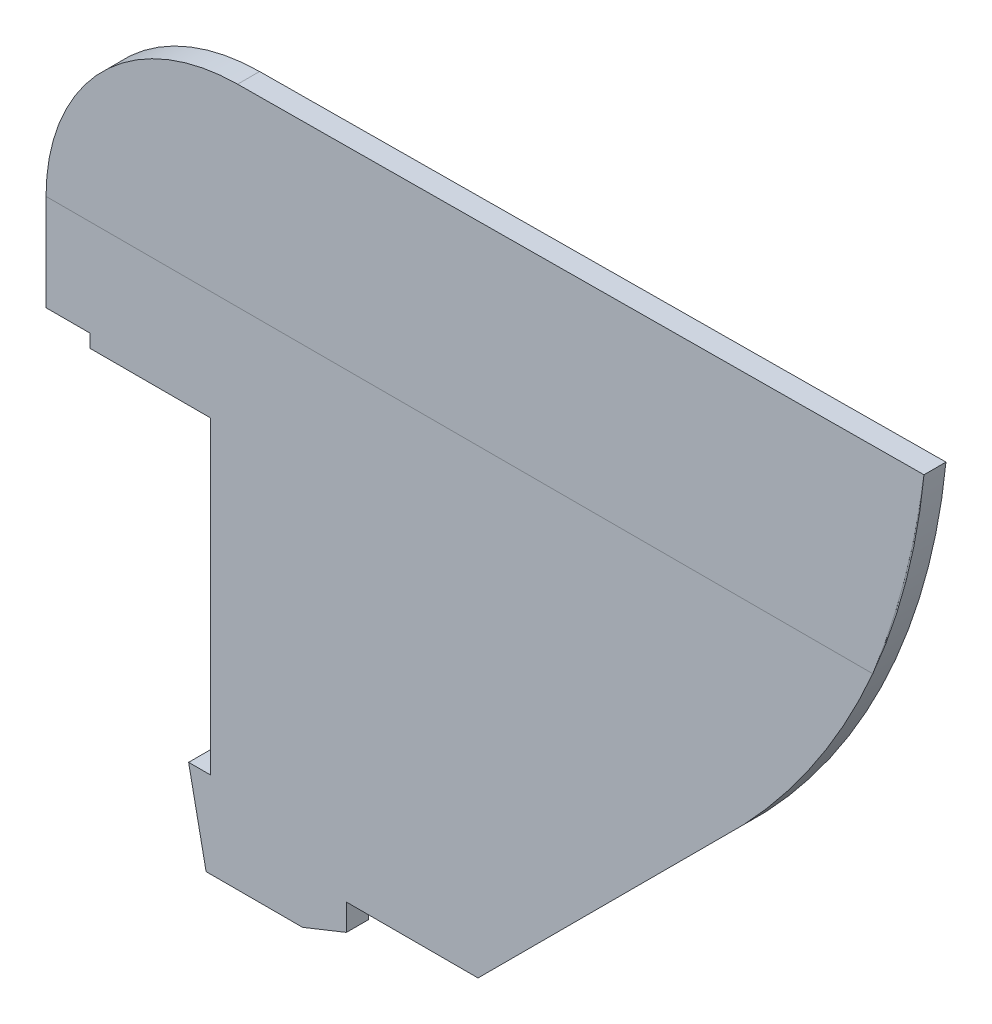
ISO-10303-21;
HEADER;
FILE_DESCRIPTION(('STEP AP214'),'2;1');
FILE_NAME('part.step','',(''),(''),'','','');
FILE_SCHEMA(('AUTOMOTIVE_DESIGN { 1 0 10303 214 1 1 1 1 }'));
ENDSEC;
DATA;
#1=APPLICATION_CONTEXT('core data for automotive mechanical design processes');
#2=APPLICATION_PROTOCOL_DEFINITION('international standard','automotive_design',2000,#1);
#3=PRODUCT_CONTEXT('',#1,'mechanical');
#4=PRODUCT('Part','Part','',(#3));
#5=PRODUCT_RELATED_PRODUCT_CATEGORY('part','',(#4));
#6=PRODUCT_DEFINITION_FORMATION('','',#4);
#7=PRODUCT_DEFINITION_CONTEXT('part definition',#1,'design');
#8=PRODUCT_DEFINITION('design','',#6,#7);
#9=PRODUCT_DEFINITION_SHAPE('','',#8);
#10=(LENGTH_UNIT() NAMED_UNIT(*) SI_UNIT(.MILLI.,.METRE.));
#11=(NAMED_UNIT(*) PLANE_ANGLE_UNIT() SI_UNIT($,.RADIAN.));
#12=(NAMED_UNIT(*) SI_UNIT($,.STERADIAN.) SOLID_ANGLE_UNIT());
#13=UNCERTAINTY_MEASURE_WITH_UNIT(LENGTH_MEASURE(1.E-05),#10,'distance_accuracy_value','');
#14=(GEOMETRIC_REPRESENTATION_CONTEXT(3) GLOBAL_UNCERTAINTY_ASSIGNED_CONTEXT((#13)) GLOBAL_UNIT_ASSIGNED_CONTEXT((#10,
#11,#12)) REPRESENTATION_CONTEXT('',''));
#15=CARTESIAN_POINT('',(0.,0.,0.));
#16=DIRECTION('',(0.,0.,1.));
#17=DIRECTION('',(1.,0.,0.));
#18=AXIS2_PLACEMENT_3D('',#15,#16,#17);
#19=CARTESIAN_POINT('',(44.,0.,5.));
#20=DIRECTION('',(0.,0.,-1.));
#21=DIRECTION('',(-1.,0.,0.));
#22=AXIS2_PLACEMENT_3D('',#19,#20,#21);
#23=PLANE('',#22);
#24=CARTESIAN_POINT('',(16.1608903466328,68.6928302263927,5.));
#25=DIRECTION('',(0.,0.,1.));
#26=DIRECTION('',(1.,0.,0.));
#27=AXIS2_PLACEMENT_3D('',#24,#25,#26);
#28=CIRCLE('',#27,185.524859899226);
#29=CARTESIAN_POINT('',(188.5,0.,5.));
#30=VERTEX_POINT('',#29);
#31=CARTESIAN_POINT('',(200.182925478254,45.1266632354799,5.));
#32=VERTEX_POINT('',#31);
#33=EDGE_CURVE('E320',#30,#32,#28,.T.);
#34=ORIENTED_EDGE('',*,*,#33,.F.);
#35=CARTESIAN_POINT('',(49.0804526377718,60.1702237350326,5.));
#36=DIRECTION('',(0.,0.,1.));
#37=DIRECTION('',(1.,0.,0.));
#38=AXIS2_PLACEMENT_3D('',#35,#36,#37);
#39=CIRCLE('',#38,151.849484724224);
#40=EDGE_CURVE('E367',#30,#32,#39,.T.);
#41=ORIENTED_EDGE('',*,*,#40,.T.);
#42=EDGE_LOOP('',(#34,#41));
#43=FACE_BOUND('',#42,.T.);
#44=ADVANCED_FACE('F39',(#43),#23,.F.);
#45=DIRECTION('',(1.,0.,0.));
#46=VECTOR('',#45,1.);
#47=CARTESIAN_POINT('',(36.4873586883436,-115.098494092417,5.));
#48=LINE('',#47,#46);
#49=CARTESIAN_POINT('',(36.4873586883436,-115.098494092417,5.));
#50=VERTEX_POINT('',#49);
#51=CARTESIAN_POINT('',(58.4873586883436,-115.098494092417,5.));
#52=VERTEX_POINT('',#51);
#53=EDGE_CURVE('E265',#50,#52,#48,.T.);
#54=ORIENTED_EDGE('',*,*,#53,.T.);
#55=DIRECTION('',(-0.928476690885259,-0.371390676354104,0.));
#56=VECTOR('',#55,1.);
#57=CARTESIAN_POINT('',(68.4873586883436,-111.098494092417,5.));
#58=LINE('',#57,#56);
#59=CARTESIAN_POINT('',(68.4873586883436,-111.098494092417,5.));
#60=VERTEX_POINT('',#59);
#61=EDGE_CURVE('E168',#60,#52,#58,.T.);
#62=ORIENTED_EDGE('',*,*,#61,.F.);
#63=DIRECTION('',(0.,-1.,0.));
#64=VECTOR('',#63,1.);
#65=CARTESIAN_POINT('',(68.4873586883436,-105.098494092417,5.));
#66=LINE('',#65,#64);
#67=CARTESIAN_POINT('',(68.4873586883436,-105.098494092417,5.));
#68=VERTEX_POINT('',#67);
#69=EDGE_CURVE('E279',#68,#60,#66,.T.);
#70=ORIENTED_EDGE('',*,*,#69,.F.);
#71=DIRECTION('',(-1.,0.,0.));
#72=VECTOR('',#71,1.);
#73=CARTESIAN_POINT('',(88.4873586883436,-105.098494092417,5.));
#74=LINE('',#73,#72);
#75=CARTESIAN_POINT('',(98.4873586883435,-105.098494092417,5.));
#76=VERTEX_POINT('',#75);
#77=EDGE_CURVE('E276',#76,#68,#74,.T.);
#78=ORIENTED_EDGE('',*,*,#77,.F.);
#79=DIRECTION('',(0.707106781186546,0.707106781186549,0.));
#80=VECTOR('',#79,1.);
#81=CARTESIAN_POINT('',(88.4873586883436,-115.098494092417,5.));
#82=LINE('',#81,#80);
#83=CARTESIAN_POINT('',(159.198036806998,-44.3878159737617,5.));
#84=VERTEX_POINT('',#83);
#85=EDGE_CURVE('E176',#76,#84,#82,.T.);
#86=ORIENTED_EDGE('',*,*,#85,.T.);
#87=EDGE_CURVE('E206',#84,#30,#39,.T.);
#88=ORIENTED_EDGE('',*,*,#87,.T.);
#89=DIRECTION('',(1.,0.,0.));
#90=VECTOR('',#89,1.);
#91=CARTESIAN_POINT('',(0.,0.,5.));
#92=LINE('',#91,#90);
#93=CARTESIAN_POINT('',(0.,0.,5.));
#94=VERTEX_POINT('',#93);
#95=EDGE_CURVE('E309',#94,#30,#92,.T.);
#96=ORIENTED_EDGE('',*,*,#95,.F.);
#97=DIRECTION('',(0.,-1.,0.));
#98=VECTOR('',#97,1.);
#99=CARTESIAN_POINT('',(0.,0.,5.));
#100=LINE('',#99,#98);
#101=CARTESIAN_POINT('',(0.,-22.,5.));
#102=VERTEX_POINT('',#101);
#103=EDGE_CURVE('E200',#94,#102,#100,.T.);
#104=ORIENTED_EDGE('',*,*,#103,.T.);
#105=DIRECTION('',(-1.,0.,0.));
#106=VECTOR('',#105,1.);
#107=CARTESIAN_POINT('',(0.,-22.,5.));
#108=LINE('',#107,#106);
#109=CARTESIAN_POINT('',(10.,-22.,5.));
#110=VERTEX_POINT('',#109);
#111=EDGE_CURVE('E296',#110,#102,#108,.T.);
#112=ORIENTED_EDGE('',*,*,#111,.F.);
#113=DIRECTION('',(0.,1.,0.));
#114=VECTOR('',#113,1.);
#115=CARTESIAN_POINT('',(10.,-25.,5.));
#116=LINE('',#115,#114);
#117=CARTESIAN_POINT('',(10.,-25.,5.));
#118=VERTEX_POINT('',#117);
#119=EDGE_CURVE('E288',#118,#110,#116,.T.);
#120=ORIENTED_EDGE('',*,*,#119,.F.);
#121=DIRECTION('',(1.,0.,0.));
#122=VECTOR('',#121,1.);
#123=CARTESIAN_POINT('',(0.,-25.,5.));
#124=LINE('',#123,#122);
#125=CARTESIAN_POINT('',(37.5,-25.,5.));
#126=VERTEX_POINT('',#125);
#127=EDGE_CURVE('E352',#118,#126,#124,.T.);
#128=ORIENTED_EDGE('',*,*,#127,.T.);
#129=DIRECTION('',(0.,-1.,0.));
#130=VECTOR('',#129,1.);
#131=CARTESIAN_POINT('',(37.5,-25.,5.));
#132=LINE('',#131,#130);
#133=CARTESIAN_POINT('',(37.4999999999998,-95.5,5.));
#134=VERTEX_POINT('',#133);
#135=EDGE_CURVE('E234',#126,#134,#132,.T.);
#136=ORIENTED_EDGE('',*,*,#135,.T.);
#137=DIRECTION('',(-1.,0.,0.));
#138=VECTOR('',#137,1.);
#139=CARTESIAN_POINT('',(37.4999999999998,-95.5,5.));
#140=LINE('',#139,#138);
#141=CARTESIAN_POINT('',(32.4999999999998,-95.5,5.));
#142=VERTEX_POINT('',#141);
#143=EDGE_CURVE('E357',#134,#142,#140,.T.);
#144=ORIENTED_EDGE('',*,*,#143,.T.);
#145=DIRECTION('',(0.199367934417191,-0.979924704620831,0.));
#146=VECTOR('',#145,1.);
#147=CARTESIAN_POINT('',(32.4999999999998,-95.5,5.));
#148=LINE('',#147,#146);
#149=EDGE_CURVE('E360',#142,#50,#148,.T.);
#150=ORIENTED_EDGE('',*,*,#149,.T.);
#151=EDGE_LOOP('',(#54,#62,#70,#78,#86,#88,#96,#104,#112,#120,#128,#136,#144,#150));
#152=FACE_BOUND('',#151,.T.);
#153=ADVANCED_FACE('F386',(#152),#23,.F.);
#154=CARTESIAN_POINT('',(44.,0.,5.));
#155=DIRECTION('',(0.,0.,-1.));
#156=DIRECTION('',(-1.,0.,0.));
#157=AXIS2_PLACEMENT_3D('',#154,#155,#156);
#158=CYLINDRICAL_SURFACE('',#157,44.);
#159=CARTESIAN_POINT('',(44.,0.,0.));
#160=DIRECTION('',(0.,0.,1.));
#161=DIRECTION('',(-1.,0.,0.));
#162=AXIS2_PLACEMENT_3D('',#159,#160,#161);
#163=CIRCLE('',#162,44.);
#164=CARTESIAN_POINT('',(43.6829254782544,43.9988575277547,0.));
#165=VERTEX_POINT('',#164);
#166=CARTESIAN_POINT('',(0.,0.,0.));
#167=VERTEX_POINT('',#166);
#168=EDGE_CURVE('E348',#165,#167,#163,.T.);
#169=ORIENTED_EDGE('',*,*,#168,.T.);
#170=DIRECTION('',(0.,0.,-1.));
#171=VECTOR('',#170,1.);
#172=CARTESIAN_POINT('',(0.,0.,5.));
#173=LINE('',#172,#171);
#174=EDGE_CURVE('E11',#94,#167,#173,.T.);
#175=ORIENTED_EDGE('',*,*,#174,.F.);
#176=DIRECTION('',(0.,0.,-1.));
#177=VECTOR('',#176,1.);
#178=CARTESIAN_POINT('',(0.,0.,5.01));
#179=LINE('',#178,#177);
#180=CARTESIAN_POINT('',(0.,0.,5.01));
#181=VERTEX_POINT('',#180);
#182=EDGE_CURVE('E344',#181,#94,#179,.T.);
#183=ORIENTED_EDGE('',*,*,#182,.F.);
#184=CARTESIAN_POINT('',(44.,0.,5.01));
#185=DIRECTION('',(0.,0.,1.));
#186=DIRECTION('',(1.,0.,0.));
#187=AXIS2_PLACEMENT_3D('',#184,#185,#186);
#188=CIRCLE('',#187,44.);
#189=CARTESIAN_POINT('',(43.6829254782544,43.9988575277547,5.01));
#190=VERTEX_POINT('',#189);
#191=EDGE_CURVE('E315',#190,#181,#188,.T.);
#192=ORIENTED_EDGE('',*,*,#191,.F.);
#193=DIRECTION('',(0.,0.,-1.));
#194=VECTOR('',#193,1.);
#195=CARTESIAN_POINT('',(43.6829254782544,43.9988575277547,5.));
#196=LINE('',#195,#194);
#197=EDGE_CURVE('E201',#190,#165,#196,.T.);
#198=ORIENTED_EDGE('',*,*,#197,.T.);
#199=EDGE_LOOP('',(#169,#175,#183,#192,#198));
#200=FACE_BOUND('',#199,.T.);
#201=ADVANCED_FACE('F41',(#200),#158,.T.);
#202=CARTESIAN_POINT('',(0.,0.,5.));
#203=DIRECTION('',(1.,0.,0.));
#204=DIRECTION('',(0.,1.,0.));
#205=AXIS2_PLACEMENT_3D('',#202,#203,#204);
#206=PLANE('',#205);
#207=DIRECTION('',(0.,-1.,0.));
#208=VECTOR('',#207,1.);
#209=CARTESIAN_POINT('',(0.,0.,0.));
#210=LINE('',#209,#208);
#211=CARTESIAN_POINT('',(0.,-22.,0.));
#212=VERTEX_POINT('',#211);
#213=EDGE_CURVE('E249',#167,#212,#210,.T.);
#214=ORIENTED_EDGE('',*,*,#213,.T.);
#215=DIRECTION('',(0.,0.,1.));
#216=VECTOR('',#215,1.);
#217=CARTESIAN_POINT('',(0.,-22.,0.));
#218=LINE('',#217,#216);
#219=EDGE_CURVE('E305',#212,#102,#218,.T.);
#220=ORIENTED_EDGE('',*,*,#219,.T.);
#221=ORIENTED_EDGE('',*,*,#103,.F.);
#222=ORIENTED_EDGE('',*,*,#174,.T.);
#223=EDGE_LOOP('',(#214,#220,#221,#222));
#224=FACE_BOUND('',#223,.T.);
#225=ADVANCED_FACE('F376',(#224),#206,.F.);
#226=CARTESIAN_POINT('',(0.,-25.,5.));
#227=DIRECTION('',(0.,1.,0.));
#228=DIRECTION('',(0.,0.,1.));
#229=AXIS2_PLACEMENT_3D('',#226,#227,#228);
#230=PLANE('',#229);
#231=ORIENTED_EDGE('',*,*,#127,.F.);
#232=DIRECTION('',(0.,0.,1.));
#233=VECTOR('',#232,1.);
#234=CARTESIAN_POINT('',(10.,-25.,0.));
#235=LINE('',#234,#233);
#236=CARTESIAN_POINT('',(10.,-25.,0.));
#237=VERTEX_POINT('',#236);
#238=EDGE_CURVE('E299',#237,#118,#235,.T.);
#239=ORIENTED_EDGE('',*,*,#238,.F.);
#240=DIRECTION('',(1.,0.,0.));
#241=VECTOR('',#240,1.);
#242=CARTESIAN_POINT('',(0.,-25.,0.));
#243=LINE('',#242,#241);
#244=CARTESIAN_POINT('',(37.5,-25.,0.));
#245=VERTEX_POINT('',#244);
#246=EDGE_CURVE('E240',#237,#245,#243,.T.);
#247=ORIENTED_EDGE('',*,*,#246,.T.);
#248=DIRECTION('',(0.,0.,-1.));
#249=VECTOR('',#248,1.);
#250=CARTESIAN_POINT('',(37.5,-25.,5.));
#251=LINE('',#250,#249);
#252=EDGE_CURVE('E48',#126,#245,#251,.T.);
#253=ORIENTED_EDGE('',*,*,#252,.F.);
#254=EDGE_LOOP('',(#231,#239,#247,#253));
#255=FACE_BOUND('',#254,.T.);
#256=ADVANCED_FACE('F384',(#255),#230,.F.);
#257=CARTESIAN_POINT('',(37.5,-25.,5.));
#258=DIRECTION('',(1.,0.,0.));
#259=DIRECTION('',(0.,1.,0.));
#260=AXIS2_PLACEMENT_3D('',#257,#258,#259);
#261=PLANE('',#260);
#262=DIRECTION('',(0.,-1.,0.));
#263=VECTOR('',#262,1.);
#264=CARTESIAN_POINT('',(37.5,-25.,0.));
#265=LINE('',#264,#263);
#266=CARTESIAN_POINT('',(37.4999999999998,-95.5,0.));
#267=VERTEX_POINT('',#266);
#268=EDGE_CURVE('E233',#245,#267,#265,.T.);
#269=ORIENTED_EDGE('',*,*,#268,.T.);
#270=DIRECTION('',(0.,0.,-1.));
#271=VECTOR('',#270,1.);
#272=CARTESIAN_POINT('',(37.4999999999998,-95.5,5.));
#273=LINE('',#272,#271);
#274=EDGE_CURVE('E221',#134,#267,#273,.T.);
#275=ORIENTED_EDGE('',*,*,#274,.F.);
#276=ORIENTED_EDGE('',*,*,#135,.F.);
#277=ORIENTED_EDGE('',*,*,#252,.T.);
#278=EDGE_LOOP('',(#269,#275,#276,#277));
#279=FACE_BOUND('',#278,.T.);
#280=ADVANCED_FACE('F231',(#279),#261,.F.);
#281=CARTESIAN_POINT('',(37.4999999999998,-95.5,5.));
#282=DIRECTION('',(0.,-1.,0.));
#283=DIRECTION('',(1.,0.,0.));
#284=AXIS2_PLACEMENT_3D('',#281,#282,#283);
#285=PLANE('',#284);
#286=DIRECTION('',(-1.,0.,0.));
#287=VECTOR('',#286,1.);
#288=CARTESIAN_POINT('',(37.4999999999998,-95.5,0.));
#289=LINE('',#288,#287);
#290=CARTESIAN_POINT('',(32.4999999999998,-95.5,0.));
#291=VERTEX_POINT('',#290);
#292=EDGE_CURVE('E242',#267,#291,#289,.T.);
#293=ORIENTED_EDGE('',*,*,#292,.T.);
#294=DIRECTION('',(0.,0.,-1.));
#295=VECTOR('',#294,1.);
#296=CARTESIAN_POINT('',(32.4999999999998,-95.5,5.));
#297=LINE('',#296,#295);
#298=EDGE_CURVE('E217',#142,#291,#297,.T.);
#299=ORIENTED_EDGE('',*,*,#298,.F.);
#300=ORIENTED_EDGE('',*,*,#143,.F.);
#301=ORIENTED_EDGE('',*,*,#274,.T.);
#302=EDGE_LOOP('',(#293,#299,#300,#301));
#303=FACE_BOUND('',#302,.T.);
#304=ADVANCED_FACE('F427',(#303),#285,.F.);
#305=CARTESIAN_POINT('',(32.4999999999998,-95.5,5.));
#306=DIRECTION('',(0.979924704620831,0.199367934417191,0.));
#307=DIRECTION('',(-0.199367934417191,0.979924704620831,0.));
#308=AXIS2_PLACEMENT_3D('',#305,#306,#307);
#309=PLANE('',#308);
#310=DIRECTION('',(0.199367934417191,-0.979924704620831,0.));
#311=VECTOR('',#310,1.);
#312=CARTESIAN_POINT('',(32.4999999999998,-95.5,0.));
#313=LINE('',#312,#311);
#314=CARTESIAN_POINT('',(36.4873586883436,-115.098494092417,0.));
#315=VERTEX_POINT('',#314);
#316=EDGE_CURVE('E194',#291,#315,#313,.T.);
#317=ORIENTED_EDGE('',*,*,#316,.T.);
#318=DIRECTION('',(0.,0.,-1.));
#319=VECTOR('',#318,1.);
#320=CARTESIAN_POINT('',(36.4873586883436,-115.098494092417,5.));
#321=LINE('',#320,#319);
#322=EDGE_CURVE('E213',#50,#315,#321,.T.);
#323=ORIENTED_EDGE('',*,*,#322,.F.);
#324=ORIENTED_EDGE('',*,*,#149,.F.);
#325=ORIENTED_EDGE('',*,*,#298,.T.);
#326=EDGE_LOOP('',(#317,#323,#324,#325));
#327=FACE_BOUND('',#326,.T.);
#328=ADVANCED_FACE('F256',(#327),#309,.F.);
#329=CARTESIAN_POINT('',(36.4873586883436,-115.098494092417,5.));
#330=DIRECTION('',(0.,1.,0.));
#331=DIRECTION('',(0.,0.,1.));
#332=AXIS2_PLACEMENT_3D('',#329,#330,#331);
#333=PLANE('',#332);
#334=DIRECTION('',(1.,0.,0.));
#335=VECTOR('',#334,1.);
#336=CARTESIAN_POINT('',(36.4873586883436,-115.098494092417,0.));
#337=LINE('',#336,#335);
#338=CARTESIAN_POINT('',(58.4873586883436,-115.098494092417,0.));
#339=VERTEX_POINT('',#338);
#340=EDGE_CURVE('E186',#315,#339,#337,.T.);
#341=ORIENTED_EDGE('',*,*,#340,.T.);
#342=DIRECTION('',(0.,0.,1.));
#343=VECTOR('',#342,1.);
#344=CARTESIAN_POINT('',(58.4873586883436,-115.098494092417,0.));
#345=LINE('',#344,#343);
#346=EDGE_CURVE('E285',#339,#52,#345,.T.);
#347=ORIENTED_EDGE('',*,*,#346,.T.);
#348=ORIENTED_EDGE('',*,*,#53,.F.);
#349=ORIENTED_EDGE('',*,*,#322,.T.);
#350=EDGE_LOOP('',(#341,#347,#348,#349));
#351=FACE_BOUND('',#350,.T.);
#352=ADVANCED_FACE('F262',(#351),#333,.F.);
#353=CARTESIAN_POINT('',(88.4873586883436,-115.098494092417,5.));
#354=DIRECTION('',(-0.707106781186549,0.707106781186546,0.));
#355=DIRECTION('',(-0.707106781186546,-0.707106781186549,0.));
#356=AXIS2_PLACEMENT_3D('',#353,#354,#355);
#357=PLANE('',#356);
#358=ORIENTED_EDGE('',*,*,#85,.F.);
#359=DIRECTION('',(0.,0.,1.));
#360=VECTOR('',#359,1.);
#361=CARTESIAN_POINT('',(98.4873586883435,-105.098494092417,0.));
#362=LINE('',#361,#360);
#363=CARTESIAN_POINT('',(98.4873586883435,-105.098494092417,0.));
#364=VERTEX_POINT('',#363);
#365=EDGE_CURVE('E162',#364,#76,#362,.T.);
#366=ORIENTED_EDGE('',*,*,#365,.F.);
#367=DIRECTION('',(0.707106781186546,0.707106781186549,0.));
#368=VECTOR('',#367,1.);
#369=CARTESIAN_POINT('',(88.4873586883436,-115.098494092417,0.));
#370=LINE('',#369,#368);
#371=CARTESIAN_POINT('',(159.198036806998,-44.3878159737617,0.));
#372=VERTEX_POINT('',#371);
#373=EDGE_CURVE('E174',#364,#372,#370,.T.);
#374=ORIENTED_EDGE('',*,*,#373,.T.);
#375=DIRECTION('',(0.,0.,-1.));
#376=VECTOR('',#375,1.);
#377=CARTESIAN_POINT('',(159.198036806998,-44.3878159737617,5.));
#378=LINE('',#377,#376);
#379=EDGE_CURVE('E210',#84,#372,#378,.T.);
#380=ORIENTED_EDGE('',*,*,#379,.F.);
#381=EDGE_LOOP('',(#358,#366,#374,#380));
#382=FACE_BOUND('',#381,.T.);
#383=ADVANCED_FACE('F172',(#382),#357,.F.);
#384=CARTESIAN_POINT('',(49.0804526377718,60.1702237350326,5.));
#385=DIRECTION('',(0.,0.,-1.));
#386=DIRECTION('',(-1.,0.,0.));
#387=AXIS2_PLACEMENT_3D('',#384,#385,#386);
#388=CYLINDRICAL_SURFACE('',#387,151.849484724224);
#389=CARTESIAN_POINT('',(49.0804526377718,60.1702237350326,0.));
#390=DIRECTION('',(0.,0.,1.));
#391=DIRECTION('',(1.,0.,0.));
#392=AXIS2_PLACEMENT_3D('',#389,#390,#391);
#393=CIRCLE('',#392,151.849484724224);
#394=CARTESIAN_POINT('',(200.182925478254,45.1266632354799,0.));
#395=VERTEX_POINT('',#394);
#396=EDGE_CURVE('E184',#372,#395,#393,.T.);
#397=ORIENTED_EDGE('',*,*,#396,.T.);
#398=DIRECTION('',(0.,0.,-1.));
#399=VECTOR('',#398,1.);
#400=CARTESIAN_POINT('',(200.182925478254,45.1266632354799,5.));
#401=LINE('',#400,#399);
#402=EDGE_CURVE('E205',#32,#395,#401,.T.);
#403=ORIENTED_EDGE('',*,*,#402,.F.);
#404=ORIENTED_EDGE('',*,*,#40,.F.);
#405=ORIENTED_EDGE('',*,*,#87,.F.);
#406=ORIENTED_EDGE('',*,*,#379,.T.);
#407=EDGE_LOOP('',(#397,#403,#404,#405,#406));
#408=FACE_BOUND('',#407,.T.);
#409=ADVANCED_FACE('F416',(#408),#388,.T.);
#410=CARTESIAN_POINT('',(43.6829254782544,43.9988575277547,5.));
#411=DIRECTION('',(0.00720623913058243,-0.999974034721699,0.));
#412=DIRECTION('',(0.999974034721699,0.00720623913058243,0.));
#413=AXIS2_PLACEMENT_3D('',#410,#411,#412);
#414=PLANE('',#413);
#415=DIRECTION('',(-0.999974034721699,-0.00720623913058243,0.));
#416=VECTOR('',#415,1.);
#417=CARTESIAN_POINT('',(43.6829254782544,43.9988575277547,0.));
#418=LINE('',#417,#416);
#419=EDGE_CURVE('E191',#395,#165,#418,.T.);
#420=ORIENTED_EDGE('',*,*,#419,.T.);
#421=ORIENTED_EDGE('',*,*,#197,.F.);
#422=DIRECTION('',(-0.999974034721698,-0.00720623913058181,0.));
#423=VECTOR('',#422,1.);
#424=CARTESIAN_POINT('',(200.182925478254,45.1266632354799,5.01));
#425=LINE('',#424,#423);
#426=CARTESIAN_POINT('',(200.182925478254,45.1266632354798,5.01));
#427=VERTEX_POINT('',#426);
#428=EDGE_CURVE('E326',#427,#190,#425,.T.);
#429=ORIENTED_EDGE('',*,*,#428,.F.);
#430=DIRECTION('',(0.,0.,-1.));
#431=VECTOR('',#430,1.);
#432=CARTESIAN_POINT('',(200.182925478254,45.1266632354798,5.01));
#433=LINE('',#432,#431);
#434=EDGE_CURVE('E330',#427,#32,#433,.T.);
#435=ORIENTED_EDGE('',*,*,#434,.T.);
#436=ORIENTED_EDGE('',*,*,#402,.T.);
#437=EDGE_LOOP('',(#420,#421,#429,#435,#436));
#438=FACE_BOUND('',#437,.T.);
#439=ADVANCED_FACE('F413',(#438),#414,.F.);
#440=CARTESIAN_POINT('',(44.,0.,0.));
#441=DIRECTION('',(0.,0.,-1.));
#442=DIRECTION('',(-1.,0.,0.));
#443=AXIS2_PLACEMENT_3D('',#440,#441,#442);
#444=PLANE('',#443);
#445=DIRECTION('',(-0.928476690885259,-0.371390676354104,0.));
#446=VECTOR('',#445,1.);
#447=CARTESIAN_POINT('',(68.4873586883436,-111.098494092417,0.));
#448=LINE('',#447,#446);
#449=CARTESIAN_POINT('',(68.4873586883436,-111.098494092417,0.));
#450=VERTEX_POINT('',#449);
#451=EDGE_CURVE('E178',#450,#339,#448,.T.);
#452=ORIENTED_EDGE('',*,*,#451,.T.);
#453=ORIENTED_EDGE('',*,*,#340,.F.);
#454=ORIENTED_EDGE('',*,*,#316,.F.);
#455=ORIENTED_EDGE('',*,*,#292,.F.);
#456=ORIENTED_EDGE('',*,*,#268,.F.);
#457=ORIENTED_EDGE('',*,*,#246,.F.);
#458=DIRECTION('',(0.,1.,0.));
#459=VECTOR('',#458,1.);
#460=CARTESIAN_POINT('',(10.,-25.,0.));
#461=LINE('',#460,#459);
#462=CARTESIAN_POINT('',(10.,-22.,0.));
#463=VERTEX_POINT('',#462);
#464=EDGE_CURVE('E293',#237,#463,#461,.T.);
#465=ORIENTED_EDGE('',*,*,#464,.T.);
#466=DIRECTION('',(-1.,0.,0.));
#467=VECTOR('',#466,1.);
#468=CARTESIAN_POINT('',(0.,-22.,0.));
#469=LINE('',#468,#467);
#470=EDGE_CURVE('E63',#463,#212,#469,.T.);
#471=ORIENTED_EDGE('',*,*,#470,.T.);
#472=ORIENTED_EDGE('',*,*,#213,.F.);
#473=ORIENTED_EDGE('',*,*,#168,.F.);
#474=ORIENTED_EDGE('',*,*,#419,.F.);
#475=ORIENTED_EDGE('',*,*,#396,.F.);
#476=ORIENTED_EDGE('',*,*,#373,.F.);
#477=DIRECTION('',(-1.,0.,0.));
#478=VECTOR('',#477,1.);
#479=CARTESIAN_POINT('',(88.4873586883436,-105.098494092417,0.));
#480=LINE('',#479,#478);
#481=CARTESIAN_POINT('',(68.4873586883436,-105.098494092417,0.));
#482=VERTEX_POINT('',#481);
#483=EDGE_CURVE('E158',#364,#482,#480,.T.);
#484=ORIENTED_EDGE('',*,*,#483,.T.);
#485=DIRECTION('',(0.,-1.,0.));
#486=VECTOR('',#485,1.);
#487=CARTESIAN_POINT('',(68.4873586883436,-105.098494092417,0.));
#488=LINE('',#487,#486);
#489=EDGE_CURVE('E55',#482,#450,#488,.T.);
#490=ORIENTED_EDGE('',*,*,#489,.T.);
#491=EDGE_LOOP('',(#452,#453,#454,#455,#456,#457,#465,#471,#472,#473,#474,#475,#476,#484,#490));
#492=FACE_BOUND('',#491,.T.);
#493=ADVANCED_FACE('F182',(#492),#444,.T.);
#494=CARTESIAN_POINT('',(0.,0.,5.01));
#495=DIRECTION('',(0.,1.,0.));
#496=DIRECTION('',(0.,0.,1.));
#497=AXIS2_PLACEMENT_3D('',#494,#495,#496);
#498=PLANE('',#497);
#499=ORIENTED_EDGE('',*,*,#95,.T.);
#500=DIRECTION('',(0.,0.,-1.));
#501=VECTOR('',#500,1.);
#502=CARTESIAN_POINT('',(188.5,0.,5.01));
#503=LINE('',#502,#501);
#504=CARTESIAN_POINT('',(188.5,0.,5.01));
#505=VERTEX_POINT('',#504);
#506=EDGE_CURVE('E340',#505,#30,#503,.T.);
#507=ORIENTED_EDGE('',*,*,#506,.F.);
#508=DIRECTION('',(1.,0.,0.));
#509=VECTOR('',#508,1.);
#510=CARTESIAN_POINT('',(0.,0.,5.01));
#511=LINE('',#510,#509);
#512=EDGE_CURVE('E319',#181,#505,#511,.T.);
#513=ORIENTED_EDGE('',*,*,#512,.F.);
#514=ORIENTED_EDGE('',*,*,#182,.T.);
#515=EDGE_LOOP('',(#499,#507,#513,#514));
#516=FACE_BOUND('',#515,.T.);
#517=ADVANCED_FACE('F409',(#516),#498,.F.);
#518=CARTESIAN_POINT('',(16.1608903466328,68.6928302263927,5.01));
#519=DIRECTION('',(0.,0.,-1.));
#520=DIRECTION('',(-1.,0.,0.));
#521=AXIS2_PLACEMENT_3D('',#518,#519,#520);
#522=CYLINDRICAL_SURFACE('',#521,185.524859899226);
#523=ORIENTED_EDGE('',*,*,#33,.T.);
#524=ORIENTED_EDGE('',*,*,#434,.F.);
#525=CARTESIAN_POINT('',(16.1608903466328,68.6928302263927,5.01));
#526=DIRECTION('',(0.,0.,1.));
#527=DIRECTION('',(1.,0.,0.));
#528=AXIS2_PLACEMENT_3D('',#525,#526,#527);
#529=CIRCLE('',#528,185.524859899226);
#530=EDGE_CURVE('E323',#505,#427,#529,.T.);
#531=ORIENTED_EDGE('',*,*,#530,.F.);
#532=ORIENTED_EDGE('',*,*,#506,.T.);
#533=EDGE_LOOP('',(#523,#524,#531,#532));
#534=FACE_BOUND('',#533,.T.);
#535=ADVANCED_FACE('F397',(#534),#522,.T.);
#536=CARTESIAN_POINT('',(44.,0.,5.01));
#537=DIRECTION('',(0.,0.,1.));
#538=DIRECTION('',(1.,0.,0.));
#539=AXIS2_PLACEMENT_3D('',#536,#537,#538);
#540=PLANE('',#539);
#541=ORIENTED_EDGE('',*,*,#191,.T.);
#542=ORIENTED_EDGE('',*,*,#512,.T.);
#543=ORIENTED_EDGE('',*,*,#530,.T.);
#544=ORIENTED_EDGE('',*,*,#428,.T.);
#545=EDGE_LOOP('',(#541,#542,#543,#544));
#546=FACE_BOUND('',#545,.T.);
#547=ADVANCED_FACE('F390',(#546),#540,.T.);
#548=CARTESIAN_POINT('',(0.,-22.,0.));
#549=DIRECTION('',(0.,1.,0.));
#550=DIRECTION('',(0.,0.,1.));
#551=AXIS2_PLACEMENT_3D('',#548,#549,#550);
#552=PLANE('',#551);
#553=ORIENTED_EDGE('',*,*,#111,.T.);
#554=ORIENTED_EDGE('',*,*,#219,.F.);
#555=ORIENTED_EDGE('',*,*,#470,.F.);
#556=DIRECTION('',(0.,0.,1.));
#557=VECTOR('',#556,1.);
#558=CARTESIAN_POINT('',(10.,-22.,0.));
#559=LINE('',#558,#557);
#560=EDGE_CURVE('E310',#463,#110,#559,.T.);
#561=ORIENTED_EDGE('',*,*,#560,.T.);
#562=EDGE_LOOP('',(#553,#554,#555,#561));
#563=FACE_BOUND('',#562,.T.);
#564=ADVANCED_FACE('F388',(#563),#552,.F.);
#565=CARTESIAN_POINT('',(10.,-25.,0.));
#566=DIRECTION('',(1.,0.,0.));
#567=DIRECTION('',(0.,0.,-1.));
#568=AXIS2_PLACEMENT_3D('',#565,#566,#567);
#569=PLANE('',#568);
#570=ORIENTED_EDGE('',*,*,#119,.T.);
#571=ORIENTED_EDGE('',*,*,#560,.F.);
#572=ORIENTED_EDGE('',*,*,#464,.F.);
#573=ORIENTED_EDGE('',*,*,#238,.T.);
#574=EDGE_LOOP('',(#570,#571,#572,#573));
#575=FACE_BOUND('',#574,.T.);
#576=ADVANCED_FACE('F382',(#575),#569,.F.);
#577=CARTESIAN_POINT('',(68.4873586883436,-111.098494092417,0.));
#578=DIRECTION('',(-0.371390676354104,0.928476690885259,0.));
#579=DIRECTION('',(-0.928476690885259,-0.371390676354104,0.));
#580=AXIS2_PLACEMENT_3D('',#577,#578,#579);
#581=PLANE('',#580);
#582=ORIENTED_EDGE('',*,*,#61,.T.);
#583=ORIENTED_EDGE('',*,*,#346,.F.);
#584=ORIENTED_EDGE('',*,*,#451,.F.);
#585=DIRECTION('',(0.,0.,1.));
#586=VECTOR('',#585,1.);
#587=CARTESIAN_POINT('',(68.4873586883436,-111.098494092417,0.));
#588=LINE('',#587,#586);
#589=EDGE_CURVE('E289',#450,#60,#588,.T.);
#590=ORIENTED_EDGE('',*,*,#589,.T.);
#591=EDGE_LOOP('',(#582,#583,#584,#590));
#592=FACE_BOUND('',#591,.T.);
#593=ADVANCED_FACE('F395',(#592),#581,.F.);
#594=CARTESIAN_POINT('',(68.4873586883436,-105.098494092417,0.));
#595=DIRECTION('',(-1.,0.,0.));
#596=DIRECTION('',(0.,0.,1.));
#597=AXIS2_PLACEMENT_3D('',#594,#595,#596);
#598=PLANE('',#597);
#599=ORIENTED_EDGE('',*,*,#69,.T.);
#600=ORIENTED_EDGE('',*,*,#589,.F.);
#601=ORIENTED_EDGE('',*,*,#489,.F.);
#602=DIRECTION('',(0.,0.,1.));
#603=VECTOR('',#602,1.);
#604=CARTESIAN_POINT('',(68.4873586883436,-105.098494092417,0.));
#605=LINE('',#604,#603);
#606=EDGE_CURVE('E164',#482,#68,#605,.T.);
#607=ORIENTED_EDGE('',*,*,#606,.T.);
#608=EDGE_LOOP('',(#599,#600,#601,#607));
#609=FACE_BOUND('',#608,.T.);
#610=ADVANCED_FACE('F451',(#609),#598,.F.);
#611=CARTESIAN_POINT('',(88.4873586883436,-105.098494092417,0.));
#612=DIRECTION('',(0.,1.,0.));
#613=DIRECTION('',(0.,0.,1.));
#614=AXIS2_PLACEMENT_3D('',#611,#612,#613);
#615=PLANE('',#614);
#616=ORIENTED_EDGE('',*,*,#77,.T.);
#617=ORIENTED_EDGE('',*,*,#606,.F.);
#618=ORIENTED_EDGE('',*,*,#483,.F.);
#619=ORIENTED_EDGE('',*,*,#365,.T.);
#620=EDGE_LOOP('',(#616,#617,#618,#619));
#621=FACE_BOUND('',#620,.T.);
#622=ADVANCED_FACE('F161',(#621),#615,.F.);
#623=CLOSED_SHELL('',(#44,#153,#201,#225,#256,#280,#304,#328,#352,#383,#409,#439,#493,#517,#535,
#547,#564,#576,#593,#610,#622));
#624=MANIFOLD_SOLID_BREP('B2',#623);
#625=ADVANCED_BREP_SHAPE_REPRESENTATION('',(#18,#624),#14);
#626=SHAPE_DEFINITION_REPRESENTATION(#9,#625);
ENDSEC;
END-ISO-10303-21;
